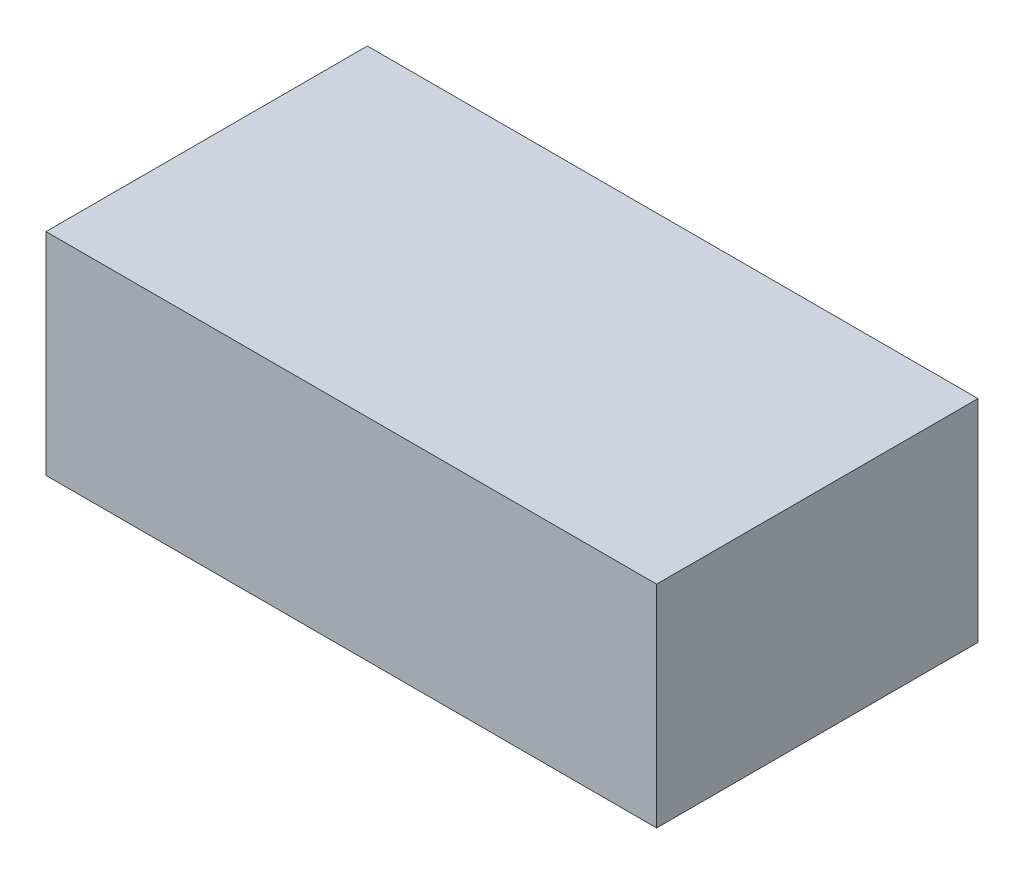
ISO-10303-21;
HEADER;
FILE_DESCRIPTION(('STEP AP214'),'2;1');
FILE_NAME('part.step','',(''),(''),'','','');
FILE_SCHEMA(('AUTOMOTIVE_DESIGN { 1 0 10303 214 1 1 1 1 }'));
ENDSEC;
DATA;
#1=APPLICATION_CONTEXT('core data for automotive mechanical design processes');
#2=APPLICATION_PROTOCOL_DEFINITION('international standard','automotive_design',2000,#1);
#3=PRODUCT_CONTEXT('',#1,'mechanical');
#4=PRODUCT('Part','Part','',(#3));
#5=PRODUCT_RELATED_PRODUCT_CATEGORY('part','',(#4));
#6=PRODUCT_DEFINITION_FORMATION('','',#4);
#7=PRODUCT_DEFINITION_CONTEXT('part definition',#1,'design');
#8=PRODUCT_DEFINITION('design','',#6,#7);
#9=PRODUCT_DEFINITION_SHAPE('','',#8);
#10=(LENGTH_UNIT() NAMED_UNIT(*) SI_UNIT(.MILLI.,.METRE.));
#11=(NAMED_UNIT(*) PLANE_ANGLE_UNIT() SI_UNIT($,.RADIAN.));
#12=(NAMED_UNIT(*) SI_UNIT($,.STERADIAN.) SOLID_ANGLE_UNIT());
#13=UNCERTAINTY_MEASURE_WITH_UNIT(LENGTH_MEASURE(1.E-05),#10,'distance_accuracy_value','');
#14=(GEOMETRIC_REPRESENTATION_CONTEXT(3) GLOBAL_UNCERTAINTY_ASSIGNED_CONTEXT((#13)) GLOBAL_UNIT_ASSIGNED_CONTEXT((#10,
#11,#12)) REPRESENTATION_CONTEXT('',''));
#15=CARTESIAN_POINT('',(0.,0.,0.));
#16=DIRECTION('',(0.,0.,1.));
#17=DIRECTION('',(1.,0.,0.));
#18=AXIS2_PLACEMENT_3D('',#15,#16,#17);
#19=CARTESIAN_POINT('',(33.25,23.,-17.5));
#20=DIRECTION('',(-1.,0.,0.));
#21=DIRECTION('',(0.,0.,1.));
#22=AXIS2_PLACEMENT_3D('',#19,#20,#21);
#23=PLANE('',#22);
#24=DIRECTION('',(0.,0.,-1.));
#25=VECTOR('',#24,1.);
#26=CARTESIAN_POINT('',(33.25,0.,-17.5));
#27=LINE('',#26,#25);
#28=CARTESIAN_POINT('',(33.25,0.,17.5));
#29=VERTEX_POINT('',#28);
#30=CARTESIAN_POINT('',(33.25,0.,-17.5));
#31=VERTEX_POINT('',#30);
#32=EDGE_CURVE('E96',#29,#31,#27,.T.);
#33=ORIENTED_EDGE('',*,*,#32,.T.);
#34=DIRECTION('',(0.,-1.,0.));
#35=VECTOR('',#34,1.);
#36=CARTESIAN_POINT('',(33.25,23.,-17.5));
#37=LINE('',#36,#35);
#38=CARTESIAN_POINT('',(33.25,23.,-17.5));
#39=VERTEX_POINT('',#38);
#40=EDGE_CURVE('E11',#39,#31,#37,.T.);
#41=ORIENTED_EDGE('',*,*,#40,.F.);
#42=DIRECTION('',(0.,0.,-1.));
#43=VECTOR('',#42,1.);
#44=CARTESIAN_POINT('',(33.25,23.,-17.5));
#45=LINE('',#44,#43);
#46=CARTESIAN_POINT('',(33.25,23.,17.5));
#47=VERTEX_POINT('',#46);
#48=EDGE_CURVE('E84',#47,#39,#45,.T.);
#49=ORIENTED_EDGE('',*,*,#48,.F.);
#50=DIRECTION('',(0.,-1.,0.));
#51=VECTOR('',#50,1.);
#52=CARTESIAN_POINT('',(33.25,23.,17.5));
#53=LINE('',#52,#51);
#54=EDGE_CURVE('E92',#47,#29,#53,.T.);
#55=ORIENTED_EDGE('',*,*,#54,.T.);
#56=EDGE_LOOP('',(#33,#41,#49,#55));
#57=FACE_BOUND('',#56,.T.);
#58=ADVANCED_FACE('F33',(#57),#23,.F.);
#59=CARTESIAN_POINT('',(-33.25,23.,-17.5));
#60=DIRECTION('',(0.,0.,1.));
#61=DIRECTION('',(1.,0.,0.));
#62=AXIS2_PLACEMENT_3D('',#59,#60,#61);
#63=PLANE('',#62);
#64=DIRECTION('',(-1.,0.,0.));
#65=VECTOR('',#64,1.);
#66=CARTESIAN_POINT('',(-33.25,0.,-17.5));
#67=LINE('',#66,#65);
#68=CARTESIAN_POINT('',(-33.25,0.,-17.5));
#69=VERTEX_POINT('',#68);
#70=EDGE_CURVE('E88',#31,#69,#67,.T.);
#71=ORIENTED_EDGE('',*,*,#70,.T.);
#72=DIRECTION('',(0.,-1.,0.));
#73=VECTOR('',#72,1.);
#74=CARTESIAN_POINT('',(-33.25,23.,-17.5));
#75=LINE('',#74,#73);
#76=CARTESIAN_POINT('',(-33.25,23.,-17.5));
#77=VERTEX_POINT('',#76);
#78=EDGE_CURVE('E41',#77,#69,#75,.T.);
#79=ORIENTED_EDGE('',*,*,#78,.F.);
#80=DIRECTION('',(-1.,0.,0.));
#81=VECTOR('',#80,1.);
#82=CARTESIAN_POINT('',(-33.25,23.,-17.5));
#83=LINE('',#82,#81);
#84=EDGE_CURVE('E79',#39,#77,#83,.T.);
#85=ORIENTED_EDGE('',*,*,#84,.F.);
#86=ORIENTED_EDGE('',*,*,#40,.T.);
#87=EDGE_LOOP('',(#71,#79,#85,#86));
#88=FACE_BOUND('',#87,.T.);
#89=ADVANCED_FACE('F87',(#88),#63,.F.);
#90=CARTESIAN_POINT('',(-33.25,23.,-17.5));
#91=DIRECTION('',(1.,0.,0.));
#92=DIRECTION('',(0.,0.,-1.));
#93=AXIS2_PLACEMENT_3D('',#90,#91,#92);
#94=PLANE('',#93);
#95=DIRECTION('',(0.,0.,1.));
#96=VECTOR('',#95,1.);
#97=CARTESIAN_POINT('',(-33.25,0.,-17.5));
#98=LINE('',#97,#96);
#99=CARTESIAN_POINT('',(-33.25,0.,17.5));
#100=VERTEX_POINT('',#99);
#101=EDGE_CURVE('E66',#69,#100,#98,.T.);
#102=ORIENTED_EDGE('',*,*,#101,.T.);
#103=DIRECTION('',(0.,-1.,0.));
#104=VECTOR('',#103,1.);
#105=CARTESIAN_POINT('',(-33.25,23.,17.5));
#106=LINE('',#105,#104);
#107=CARTESIAN_POINT('',(-33.25,23.,17.5));
#108=VERTEX_POINT('',#107);
#109=EDGE_CURVE('E89',#108,#100,#106,.T.);
#110=ORIENTED_EDGE('',*,*,#109,.F.);
#111=DIRECTION('',(0.,0.,1.));
#112=VECTOR('',#111,1.);
#113=CARTESIAN_POINT('',(-33.25,23.,-17.5));
#114=LINE('',#113,#112);
#115=EDGE_CURVE('E82',#77,#108,#114,.T.);
#116=ORIENTED_EDGE('',*,*,#115,.F.);
#117=ORIENTED_EDGE('',*,*,#78,.T.);
#118=EDGE_LOOP('',(#102,#110,#116,#117));
#119=FACE_BOUND('',#118,.T.);
#120=ADVANCED_FACE('F90',(#119),#94,.F.);
#121=CARTESIAN_POINT('',(-33.25,23.,17.5));
#122=DIRECTION('',(0.,0.,-1.));
#123=DIRECTION('',(-1.,0.,0.));
#124=AXIS2_PLACEMENT_3D('',#121,#122,#123);
#125=PLANE('',#124);
#126=DIRECTION('',(1.,0.,0.));
#127=VECTOR('',#126,1.);
#128=CARTESIAN_POINT('',(-33.25,0.,17.5));
#129=LINE('',#128,#127);
#130=EDGE_CURVE('E72',#100,#29,#129,.T.);
#131=ORIENTED_EDGE('',*,*,#130,.T.);
#132=ORIENTED_EDGE('',*,*,#54,.F.);
#133=DIRECTION('',(1.,0.,0.));
#134=VECTOR('',#133,1.);
#135=CARTESIAN_POINT('',(-33.25,23.,17.5));
#136=LINE('',#135,#134);
#137=EDGE_CURVE('E49',#108,#47,#136,.T.);
#138=ORIENTED_EDGE('',*,*,#137,.F.);
#139=ORIENTED_EDGE('',*,*,#109,.T.);
#140=EDGE_LOOP('',(#131,#132,#138,#139));
#141=FACE_BOUND('',#140,.T.);
#142=ADVANCED_FACE('F103',(#141),#125,.F.);
#143=CARTESIAN_POINT('',(0.,23.,0.));
#144=DIRECTION('',(0.,1.,0.));
#145=DIRECTION('',(0.,0.,1.));
#146=AXIS2_PLACEMENT_3D('',#143,#144,#145);
#147=PLANE('',#146);
#148=ORIENTED_EDGE('',*,*,#48,.T.);
#149=ORIENTED_EDGE('',*,*,#84,.T.);
#150=ORIENTED_EDGE('',*,*,#115,.T.);
#151=ORIENTED_EDGE('',*,*,#137,.T.);
#152=EDGE_LOOP('',(#148,#149,#150,#151));
#153=FACE_BOUND('',#152,.T.);
#154=ADVANCED_FACE('F80',(#153),#147,.T.);
#155=CARTESIAN_POINT('',(0.,0.,0.));
#156=DIRECTION('',(0.,1.,0.));
#157=DIRECTION('',(0.,0.,1.));
#158=AXIS2_PLACEMENT_3D('',#155,#156,#157);
#159=PLANE('',#158);
#160=ORIENTED_EDGE('',*,*,#32,.F.);
#161=ORIENTED_EDGE('',*,*,#130,.F.);
#162=ORIENTED_EDGE('',*,*,#101,.F.);
#163=ORIENTED_EDGE('',*,*,#70,.F.);
#164=EDGE_LOOP('',(#160,#161,#162,#163));
#165=FACE_BOUND('',#164,.T.);
#166=ADVANCED_FACE('F106',(#165),#159,.F.);
#167=CLOSED_SHELL('',(#58,#89,#120,#142,#154,#166));
#168=MANIFOLD_SOLID_BREP('B2',#167);
#169=ADVANCED_BREP_SHAPE_REPRESENTATION('',(#18,#168),#14);
#170=SHAPE_DEFINITION_REPRESENTATION(#9,#169);
ENDSEC;
END-ISO-10303-21;
